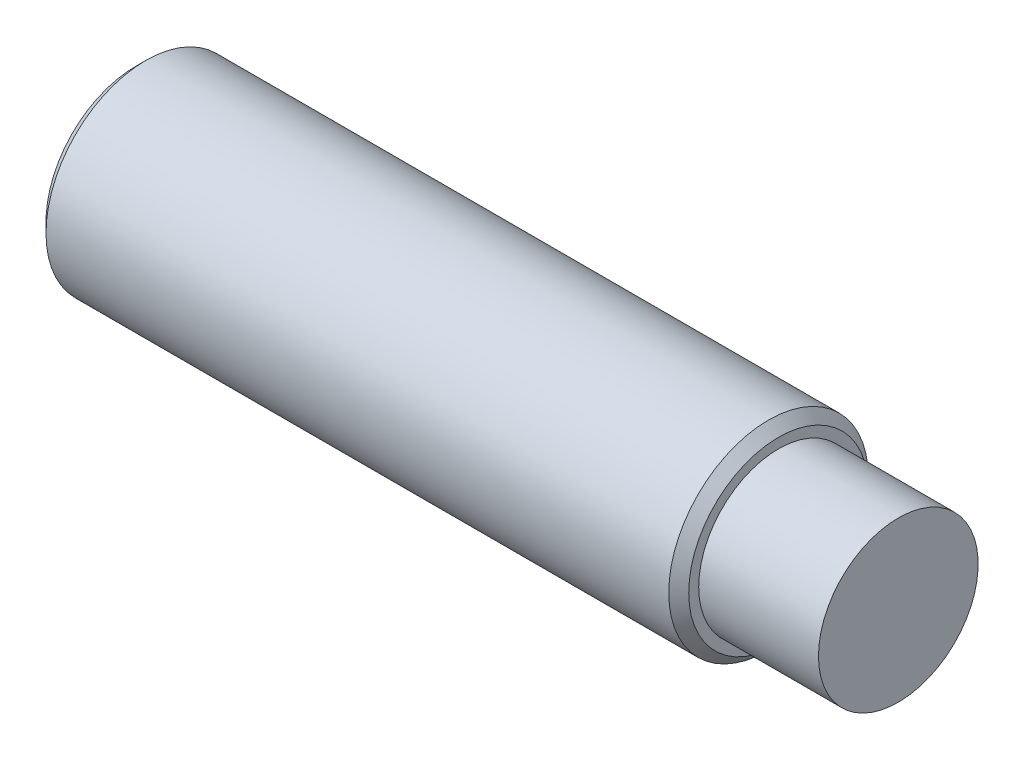
ISO-10303-21;
HEADER;
FILE_DESCRIPTION(('STEP AP214'),'2;1');
FILE_NAME('part.step','',(''),(''),'','','');
FILE_SCHEMA(('AUTOMOTIVE_DESIGN { 1 0 10303 214 1 1 1 1 }'));
ENDSEC;
DATA;
#1=APPLICATION_CONTEXT('core data for automotive mechanical design processes');
#2=APPLICATION_PROTOCOL_DEFINITION('international standard','automotive_design',2000,#1);
#3=PRODUCT_CONTEXT('',#1,'mechanical');
#4=PRODUCT('Part','Part','',(#3));
#5=PRODUCT_RELATED_PRODUCT_CATEGORY('part','',(#4));
#6=PRODUCT_DEFINITION_FORMATION('','',#4);
#7=PRODUCT_DEFINITION_CONTEXT('part definition',#1,'design');
#8=PRODUCT_DEFINITION('design','',#6,#7);
#9=PRODUCT_DEFINITION_SHAPE('','',#8);
#10=(LENGTH_UNIT() NAMED_UNIT(*) SI_UNIT(.MILLI.,.METRE.));
#11=(NAMED_UNIT(*) PLANE_ANGLE_UNIT() SI_UNIT($,.RADIAN.));
#12=(NAMED_UNIT(*) SI_UNIT($,.STERADIAN.) SOLID_ANGLE_UNIT());
#13=UNCERTAINTY_MEASURE_WITH_UNIT(LENGTH_MEASURE(1.E-05),#10,'distance_accuracy_value','');
#14=(GEOMETRIC_REPRESENTATION_CONTEXT(3) GLOBAL_UNCERTAINTY_ASSIGNED_CONTEXT((#13)) GLOBAL_UNIT_ASSIGNED_CONTEXT((#10,
#11,#12)) REPRESENTATION_CONTEXT('',''));
#15=CARTESIAN_POINT('',(0.,0.,0.));
#16=DIRECTION('',(0.,0.,1.));
#17=DIRECTION('',(1.,0.,0.));
#18=AXIS2_PLACEMENT_3D('',#15,#16,#17);
#19=CARTESIAN_POINT('',(0.,0.,0.));
#20=DIRECTION('',(1.,0.,0.));
#21=DIRECTION('',(0.,0.,-1.));
#22=AXIS2_PLACEMENT_3D('',#19,#20,#21);
#23=PLANE('',#22);
#24=CARTESIAN_POINT('',(0.,0.,0.));
#25=DIRECTION('',(-1.,0.,0.));
#26=DIRECTION('',(0.,0.,1.));
#27=AXIS2_PLACEMENT_3D('',#24,#25,#26);
#28=CIRCLE('',#27,3.);
#29=CARTESIAN_POINT('',(0.,0.,3.));
#30=VERTEX_POINT('',#29);
#31=EDGE_CURVE('E73',#30,#30,#28,.T.);
#32=ORIENTED_EDGE('',*,*,#31,.F.);
#33=EDGE_LOOP('',(#32));
#34=FACE_BOUND('',#33,.T.);
#35=CARTESIAN_POINT('',(0.,0.,0.));
#36=DIRECTION('',(1.,0.,0.));
#37=DIRECTION('',(0.,0.,-1.));
#38=AXIS2_PLACEMENT_3D('',#35,#36,#37);
#39=CIRCLE('',#38,4.5);
#40=CARTESIAN_POINT('',(0.,0.,-4.5));
#41=VERTEX_POINT('',#40);
#42=EDGE_CURVE('E10',#41,#41,#39,.F.);
#43=ORIENTED_EDGE('',*,*,#42,.T.);
#44=EDGE_LOOP('',(#43));
#45=FACE_BOUND('',#44,.T.);
#46=ADVANCED_FACE('F39',(#34,#45),#23,.F.);
#47=CARTESIAN_POINT('',(-21.6251223316182,0.,0.));
#48=DIRECTION('',(-1.,0.,0.));
#49=DIRECTION('',(0.,0.,1.));
#50=AXIS2_PLACEMENT_3D('',#47,#48,#49);
#51=CYLINDRICAL_SURFACE('',#50,5.);
#52=CARTESIAN_POINT('',(31.7,0.,0.));
#53=DIRECTION('',(-1.,0.,0.));
#54=DIRECTION('',(0.,0.,1.));
#55=AXIS2_PLACEMENT_3D('',#52,#53,#54);
#56=CIRCLE('',#55,5.);
#57=CARTESIAN_POINT('',(31.7,0.,5.));
#58=VERTEX_POINT('',#57);
#59=EDGE_CURVE('E53',#58,#58,#56,.T.);
#60=ORIENTED_EDGE('',*,*,#59,.T.);
#61=EDGE_LOOP('',(#60));
#62=FACE_BOUND('',#61,.T.);
#63=CARTESIAN_POINT('',(0.500000000000007,0.,0.));
#64=DIRECTION('',(1.,0.,0.));
#65=DIRECTION('',(0.,0.,-1.));
#66=AXIS2_PLACEMENT_3D('',#63,#64,#65);
#67=CIRCLE('',#66,5.);
#68=CARTESIAN_POINT('',(0.500000000000007,0.,-5.));
#69=VERTEX_POINT('',#68);
#70=EDGE_CURVE('E58',#69,#69,#67,.T.);
#71=ORIENTED_EDGE('',*,*,#70,.T.);
#72=EDGE_LOOP('',(#71));
#73=FACE_BOUND('',#72,.T.);
#74=ADVANCED_FACE('F90',(#62,#73),#51,.T.);
#75=CARTESIAN_POINT('',(32.2,5.,0.));
#76=DIRECTION('',(-1.,0.,0.));
#77=DIRECTION('',(0.,0.,1.));
#78=AXIS2_PLACEMENT_3D('',#75,#76,#77);
#79=PLANE('',#78);
#80=CARTESIAN_POINT('',(32.2,0.,0.));
#81=DIRECTION('',(-1.,0.,0.));
#82=DIRECTION('',(0.,0.,1.));
#83=AXIS2_PLACEMENT_3D('',#80,#81,#82);
#84=CIRCLE('',#83,4.5);
#85=CARTESIAN_POINT('',(32.2,0.,4.5));
#86=VERTEX_POINT('',#85);
#87=EDGE_CURVE('E48',#86,#86,#84,.F.);
#88=ORIENTED_EDGE('',*,*,#87,.T.);
#89=EDGE_LOOP('',(#88));
#90=FACE_BOUND('',#89,.T.);
#91=CARTESIAN_POINT('',(32.2,0.,0.));
#92=DIRECTION('',(-1.,0.,0.));
#93=DIRECTION('',(0.,0.,1.));
#94=AXIS2_PLACEMENT_3D('',#91,#92,#93);
#95=CIRCLE('',#94,4.);
#96=CARTESIAN_POINT('',(32.2,0.,4.));
#97=VERTEX_POINT('',#96);
#98=EDGE_CURVE('E64',#97,#97,#95,.T.);
#99=ORIENTED_EDGE('',*,*,#98,.T.);
#100=EDGE_LOOP('',(#99));
#101=FACE_BOUND('',#100,.T.);
#102=ADVANCED_FACE('F95',(#90,#101),#79,.F.);
#103=CARTESIAN_POINT('',(-21.6251223316182,0.,0.));
#104=DIRECTION('',(-1.,0.,0.));
#105=DIRECTION('',(0.,0.,1.));
#106=AXIS2_PLACEMENT_3D('',#103,#104,#105);
#107=CYLINDRICAL_SURFACE('',#106,4.);
#108=ORIENTED_EDGE('',*,*,#98,.F.);
#109=EDGE_LOOP('',(#108));
#110=FACE_BOUND('',#109,.T.);
#111=CARTESIAN_POINT('',(38.2,0.,0.));
#112=DIRECTION('',(-1.,0.,0.));
#113=DIRECTION('',(0.,0.,1.));
#114=AXIS2_PLACEMENT_3D('',#111,#112,#113);
#115=CIRCLE('',#114,4.);
#116=CARTESIAN_POINT('',(38.2,0.,4.));
#117=VERTEX_POINT('',#116);
#118=EDGE_CURVE('E68',#117,#117,#115,.T.);
#119=ORIENTED_EDGE('',*,*,#118,.T.);
#120=EDGE_LOOP('',(#119));
#121=FACE_BOUND('',#120,.T.);
#122=ADVANCED_FACE('F111',(#110,#121),#107,.T.);
#123=CARTESIAN_POINT('',(38.2,4.,0.));
#124=DIRECTION('',(-1.,0.,0.));
#125=DIRECTION('',(0.,0.,1.));
#126=AXIS2_PLACEMENT_3D('',#123,#124,#125);
#127=PLANE('',#126);
#128=ORIENTED_EDGE('',*,*,#118,.F.);
#129=EDGE_LOOP('',(#128));
#130=FACE_BOUND('',#129,.T.);
#131=ADVANCED_FACE('F104',(#130),#127,.F.);
#132=CARTESIAN_POINT('',(31.7,0.,0.));
#133=DIRECTION('',(-1.,0.,0.));
#134=DIRECTION('',(0.,0.,1.));
#135=AXIS2_PLACEMENT_3D('',#132,#133,#134);
#136=CONICAL_SURFACE('',#135,5.,0.785398163397447);
#137=ORIENTED_EDGE('',*,*,#87,.F.);
#138=EDGE_LOOP('',(#137));
#139=FACE_BOUND('',#138,.T.);
#140=ORIENTED_EDGE('',*,*,#59,.F.);
#141=EDGE_LOOP('',(#140));
#142=FACE_BOUND('',#141,.T.);
#143=ADVANCED_FACE('F100',(#139,#142),#136,.T.);
#144=CARTESIAN_POINT('',(0.,0.,0.));
#145=DIRECTION('',(1.,0.,0.));
#146=DIRECTION('',(0.,0.,-1.));
#147=AXIS2_PLACEMENT_3D('',#144,#145,#146);
#148=CONICAL_SURFACE('',#147,4.5,0.785398163397444);
#149=ORIENTED_EDGE('',*,*,#70,.F.);
#150=EDGE_LOOP('',(#149));
#151=FACE_BOUND('',#150,.T.);
#152=ORIENTED_EDGE('',*,*,#42,.F.);
#153=EDGE_LOOP('',(#152));
#154=FACE_BOUND('',#153,.T.);
#155=ADVANCED_FACE('F42',(#151,#154),#148,.T.);
#156=CARTESIAN_POINT('',(10.,0.,0.));
#157=DIRECTION('',(-1.,0.,0.));
#158=DIRECTION('',(0.,0.,1.));
#159=AXIS2_PLACEMENT_3D('',#156,#157,#158);
#160=CYLINDRICAL_SURFACE('',#159,3.);
#161=CARTESIAN_POINT('',(10.,0.,0.));
#162=DIRECTION('',(-1.,0.,0.));
#163=DIRECTION('',(0.,0.,1.));
#164=AXIS2_PLACEMENT_3D('',#161,#162,#163);
#165=CIRCLE('',#164,3.);
#166=CARTESIAN_POINT('',(10.,0.,3.));
#167=VERTEX_POINT('',#166);
#168=EDGE_CURVE('E72',#167,#167,#165,.T.);
#169=ORIENTED_EDGE('',*,*,#168,.F.);
#170=EDGE_LOOP('',(#169));
#171=FACE_BOUND('',#170,.T.);
#172=ORIENTED_EDGE('',*,*,#31,.T.);
#173=EDGE_LOOP('',(#172));
#174=FACE_BOUND('',#173,.T.);
#175=ADVANCED_FACE('F83',(#171,#174),#160,.F.);
#176=CARTESIAN_POINT('',(10.,0.,0.));
#177=DIRECTION('',(-1.,0.,0.));
#178=DIRECTION('',(0.,0.,1.));
#179=AXIS2_PLACEMENT_3D('',#176,#177,#178);
#180=PLANE('',#179);
#181=ORIENTED_EDGE('',*,*,#168,.T.);
#182=EDGE_LOOP('',(#181));
#183=FACE_BOUND('',#182,.T.);
#184=ADVANCED_FACE('F81',(#183),#180,.T.);
#185=CLOSED_SHELL('',(#46,#74,#102,#122,#131,#143,#155,#175,#184));
#186=MANIFOLD_SOLID_BREP('B2',#185);
#187=ADVANCED_BREP_SHAPE_REPRESENTATION('',(#18,#186),#14);
#188=SHAPE_DEFINITION_REPRESENTATION(#9,#187);
ENDSEC;
END-ISO-10303-21;
